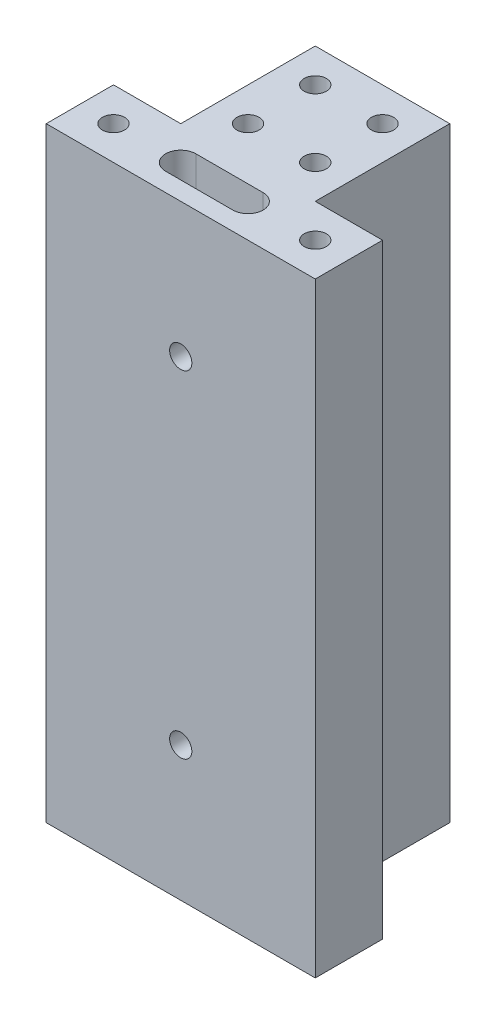
ISO-10303-21;
HEADER;
FILE_DESCRIPTION(('STEP AP214'),'2;1');
FILE_NAME('part.step','',(''),(''),'','','');
FILE_SCHEMA(('AUTOMOTIVE_DESIGN { 1 0 10303 214 1 1 1 1 }'));
ENDSEC;
DATA;
#1=APPLICATION_CONTEXT('core data for automotive mechanical design processes');
#2=APPLICATION_PROTOCOL_DEFINITION('international standard','automotive_design',2000,#1);
#3=PRODUCT_CONTEXT('',#1,'mechanical');
#4=PRODUCT('Part','Part','',(#3));
#5=PRODUCT_RELATED_PRODUCT_CATEGORY('part','',(#4));
#6=PRODUCT_DEFINITION_FORMATION('','',#4);
#7=PRODUCT_DEFINITION_CONTEXT('part definition',#1,'design');
#8=PRODUCT_DEFINITION('design','',#6,#7);
#9=PRODUCT_DEFINITION_SHAPE('','',#8);
#10=(LENGTH_UNIT() NAMED_UNIT(*) SI_UNIT(.MILLI.,.METRE.));
#11=(NAMED_UNIT(*) PLANE_ANGLE_UNIT() SI_UNIT($,.RADIAN.));
#12=(NAMED_UNIT(*) SI_UNIT($,.STERADIAN.) SOLID_ANGLE_UNIT());
#13=UNCERTAINTY_MEASURE_WITH_UNIT(LENGTH_MEASURE(1.E-05),#10,'distance_accuracy_value','');
#14=(GEOMETRIC_REPRESENTATION_CONTEXT(3) GLOBAL_UNCERTAINTY_ASSIGNED_CONTEXT((#13)) GLOBAL_UNIT_ASSIGNED_CONTEXT((#10,
#11,#12)) REPRESENTATION_CONTEXT('',''));
#15=CARTESIAN_POINT('',(0.,0.,0.));
#16=DIRECTION('',(0.,0.,1.));
#17=DIRECTION('',(1.,0.,0.));
#18=AXIS2_PLACEMENT_3D('',#15,#16,#17);
#19=CARTESIAN_POINT('',(0.,90.,0.));
#20=DIRECTION('',(0.,1.,0.));
#21=DIRECTION('',(0.,0.,1.));
#22=AXIS2_PLACEMENT_3D('',#19,#20,#21);
#23=PLANE('',#22);
#24=CARTESIAN_POINT('',(-15.,90.,0.));
#25=DIRECTION('',(0.,1.,0.));
#26=DIRECTION('',(0.,0.,1.));
#27=AXIS2_PLACEMENT_3D('',#24,#25,#26);
#28=CIRCLE('',#27,1.64999999999999);
#29=CARTESIAN_POINT('',(-15.,90.,1.64999999999999));
#30=VERTEX_POINT('',#29);
#31=EDGE_CURVE('E293',#30,#30,#28,.T.);
#32=ORIENTED_EDGE('',*,*,#31,.F.);
#33=EDGE_LOOP('',(#32));
#34=FACE_BOUND('',#33,.T.);
#35=CARTESIAN_POINT('',(15.,90.,0.));
#36=DIRECTION('',(0.,1.,0.));
#37=DIRECTION('',(0.,0.,1.));
#38=AXIS2_PLACEMENT_3D('',#35,#36,#37);
#39=CIRCLE('',#38,1.64999999999999);
#40=CARTESIAN_POINT('',(15.,90.,1.64999999999999));
#41=VERTEX_POINT('',#40);
#42=EDGE_CURVE('E285',#41,#41,#39,.T.);
#43=ORIENTED_EDGE('',*,*,#42,.F.);
#44=EDGE_LOOP('',(#43));
#45=FACE_BOUND('',#44,.T.);
#46=CARTESIAN_POINT('',(5.,90.,-20.));
#47=DIRECTION('',(0.,1.,0.));
#48=DIRECTION('',(0.,0.,1.));
#49=AXIS2_PLACEMENT_3D('',#46,#47,#48);
#50=CIRCLE('',#49,1.64999999999999);
#51=CARTESIAN_POINT('',(5.,90.,-18.35));
#52=VERTEX_POINT('',#51);
#53=EDGE_CURVE('E277',#52,#52,#50,.T.);
#54=ORIENTED_EDGE('',*,*,#53,.F.);
#55=EDGE_LOOP('',(#54));
#56=FACE_BOUND('',#55,.T.);
#57=CARTESIAN_POINT('',(-5.,90.,-10.));
#58=DIRECTION('',(0.,1.,0.));
#59=DIRECTION('',(0.,0.,1.));
#60=AXIS2_PLACEMENT_3D('',#57,#58,#59);
#61=CIRCLE('',#60,1.64999999999999);
#62=CARTESIAN_POINT('',(-5.,90.,-8.35000000000001));
#63=VERTEX_POINT('',#62);
#64=EDGE_CURVE('E269',#63,#63,#61,.T.);
#65=ORIENTED_EDGE('',*,*,#64,.F.);
#66=EDGE_LOOP('',(#65));
#67=FACE_BOUND('',#66,.T.);
#68=CARTESIAN_POINT('',(-5.,90.,-20.));
#69=DIRECTION('',(0.,1.,0.));
#70=DIRECTION('',(0.,0.,1.));
#71=AXIS2_PLACEMENT_3D('',#68,#69,#70);
#72=CIRCLE('',#71,1.64999999999999);
#73=CARTESIAN_POINT('',(-5.,90.,-18.35));
#74=VERTEX_POINT('',#73);
#75=EDGE_CURVE('E261',#74,#74,#72,.T.);
#76=ORIENTED_EDGE('',*,*,#75,.F.);
#77=EDGE_LOOP('',(#76));
#78=FACE_BOUND('',#77,.T.);
#79=CARTESIAN_POINT('',(5.,90.,-10.));
#80=DIRECTION('',(0.,1.,0.));
#81=DIRECTION('',(0.,0.,1.));
#82=AXIS2_PLACEMENT_3D('',#79,#80,#81);
#83=CIRCLE('',#82,1.64999999999999);
#84=CARTESIAN_POINT('',(5.,90.,-8.35000000000001));
#85=VERTEX_POINT('',#84);
#86=EDGE_CURVE('E253',#85,#85,#83,.T.);
#87=ORIENTED_EDGE('',*,*,#86,.F.);
#88=EDGE_LOOP('',(#87));
#89=FACE_BOUND('',#88,.T.);
#90=DIRECTION('',(0.,0.,-1.));
#91=VECTOR('',#90,1.);
#92=CARTESIAN_POINT('',(-10.,90.,0.));
#93=LINE('',#92,#91);
#94=CARTESIAN_POINT('',(-10.,90.,-5.));
#95=VERTEX_POINT('',#94);
#96=CARTESIAN_POINT('',(-10.,90.,-25.));
#97=VERTEX_POINT('',#96);
#98=EDGE_CURVE('E236',#95,#97,#93,.T.);
#99=ORIENTED_EDGE('',*,*,#98,.F.);
#100=DIRECTION('',(1.,0.,0.));
#101=VECTOR('',#100,1.);
#102=CARTESIAN_POINT('',(0.,90.,-5.));
#103=LINE('',#102,#101);
#104=CARTESIAN_POINT('',(-20.,90.,-5.));
#105=VERTEX_POINT('',#104);
#106=EDGE_CURVE('E227',#105,#95,#103,.T.);
#107=ORIENTED_EDGE('',*,*,#106,.F.);
#108=DIRECTION('',(0.,0.,-1.));
#109=VECTOR('',#108,1.);
#110=CARTESIAN_POINT('',(-20.,90.,0.));
#111=LINE('',#110,#109);
#112=CARTESIAN_POINT('',(-20.,90.,5.));
#113=VERTEX_POINT('',#112);
#114=EDGE_CURVE('E235',#113,#105,#111,.T.);
#115=ORIENTED_EDGE('',*,*,#114,.F.);
#116=DIRECTION('',(1.,0.,0.));
#117=VECTOR('',#116,1.);
#118=CARTESIAN_POINT('',(0.,90.,5.));
#119=LINE('',#118,#117);
#120=CARTESIAN_POINT('',(20.,90.,5.));
#121=VERTEX_POINT('',#120);
#122=EDGE_CURVE('E229',#113,#121,#119,.T.);
#123=ORIENTED_EDGE('',*,*,#122,.T.);
#124=DIRECTION('',(0.,0.,-1.));
#125=VECTOR('',#124,1.);
#126=CARTESIAN_POINT('',(20.,90.,0.));
#127=LINE('',#126,#125);
#128=CARTESIAN_POINT('',(20.,90.,-5.));
#129=VERTEX_POINT('',#128);
#130=EDGE_CURVE('E223',#121,#129,#127,.T.);
#131=ORIENTED_EDGE('',*,*,#130,.T.);
#132=CARTESIAN_POINT('',(10.,90.,-5.));
#133=VERTEX_POINT('',#132);
#134=EDGE_CURVE('E203',#133,#129,#103,.T.);
#135=ORIENTED_EDGE('',*,*,#134,.F.);
#136=DIRECTION('',(0.,0.,-1.));
#137=VECTOR('',#136,1.);
#138=CARTESIAN_POINT('',(10.,90.,0.));
#139=LINE('',#138,#137);
#140=CARTESIAN_POINT('',(10.,90.,-25.));
#141=VERTEX_POINT('',#140);
#142=EDGE_CURVE('E214',#133,#141,#139,.T.);
#143=ORIENTED_EDGE('',*,*,#142,.T.);
#144=DIRECTION('',(1.,0.,0.));
#145=VECTOR('',#144,1.);
#146=CARTESIAN_POINT('',(0.,90.,-25.));
#147=LINE('',#146,#145);
#148=EDGE_CURVE('E219',#97,#141,#147,.T.);
#149=ORIENTED_EDGE('',*,*,#148,.F.);
#150=EDGE_LOOP('',(#99,#107,#115,#123,#131,#135,#143,#149));
#151=FACE_BOUND('',#150,.T.);
#152=CARTESIAN_POINT('',(-5.,90.,0.));
#153=DIRECTION('',(0.,1.,0.));
#154=DIRECTION('',(0.,0.,1.));
#155=AXIS2_PLACEMENT_3D('',#152,#153,#154);
#156=CIRCLE('',#155,2.25);
#157=CARTESIAN_POINT('',(-5.,90.,-2.25));
#158=VERTEX_POINT('',#157);
#159=CARTESIAN_POINT('',(-5.,90.,2.25));
#160=VERTEX_POINT('',#159);
#161=EDGE_CURVE('E137',#158,#160,#156,.T.);
#162=ORIENTED_EDGE('',*,*,#161,.F.);
#163=DIRECTION('',(1.,0.,0.));
#164=VECTOR('',#163,1.);
#165=CARTESIAN_POINT('',(-5.,90.,-2.25));
#166=LINE('',#165,#164);
#167=CARTESIAN_POINT('',(5.,90.,-2.25));
#168=VERTEX_POINT('',#167);
#169=EDGE_CURVE('E342',#158,#168,#166,.T.);
#170=ORIENTED_EDGE('',*,*,#169,.T.);
#171=CARTESIAN_POINT('',(5.,90.,0.));
#172=DIRECTION('',(0.,1.,0.));
#173=DIRECTION('',(0.,0.,1.));
#174=AXIS2_PLACEMENT_3D('',#171,#172,#173);
#175=CIRCLE('',#174,2.25);
#176=CARTESIAN_POINT('',(5.,90.,2.25000000000003));
#177=VERTEX_POINT('',#176);
#178=EDGE_CURVE('E309',#177,#168,#175,.T.);
#179=ORIENTED_EDGE('',*,*,#178,.F.);
#180=DIRECTION('',(1.,0.,0.));
#181=VECTOR('',#180,1.);
#182=CARTESIAN_POINT('',(-5.,90.,2.25000000000003));
#183=LINE('',#182,#181);
#184=EDGE_CURVE('E358',#160,#177,#183,.T.);
#185=ORIENTED_EDGE('',*,*,#184,.F.);
#186=EDGE_LOOP('',(#162,#170,#179,#185));
#187=FACE_BOUND('',#186,.T.);
#188=ADVANCED_FACE('F121',(#34,#45,#56,#67,#78,#89,#151,#187),#23,.T.);
#189=CARTESIAN_POINT('',(-10.,90.,0.));
#190=DIRECTION('',(-1.,0.,0.));
#191=DIRECTION('',(0.,0.,1.));
#192=AXIS2_PLACEMENT_3D('',#189,#190,#191);
#193=PLANE('',#192);
#194=DIRECTION('',(0.,0.,-1.));
#195=VECTOR('',#194,1.);
#196=CARTESIAN_POINT('',(-10.,0.,0.));
#197=LINE('',#196,#195);
#198=CARTESIAN_POINT('',(-10.,0.,-5.));
#199=VERTEX_POINT('',#198);
#200=CARTESIAN_POINT('',(-10.,0.,-25.));
#201=VERTEX_POINT('',#200);
#202=EDGE_CURVE('E252',#199,#201,#197,.T.);
#203=ORIENTED_EDGE('',*,*,#202,.F.);
#204=DIRECTION('',(0.,-1.,0.));
#205=VECTOR('',#204,1.);
#206=CARTESIAN_POINT('',(-10.,90.,-5.));
#207=LINE('',#206,#205);
#208=EDGE_CURVE('E13',#95,#199,#207,.T.);
#209=ORIENTED_EDGE('',*,*,#208,.F.);
#210=ORIENTED_EDGE('',*,*,#98,.T.);
#211=DIRECTION('',(0.,-1.,0.));
#212=VECTOR('',#211,1.);
#213=CARTESIAN_POINT('',(-10.,90.,-25.));
#214=LINE('',#213,#212);
#215=EDGE_CURVE('E146',#97,#201,#214,.T.);
#216=ORIENTED_EDGE('',*,*,#215,.T.);
#217=EDGE_LOOP('',(#203,#209,#210,#216));
#218=FACE_BOUND('',#217,.T.);
#219=ADVANCED_FACE('F123',(#218),#193,.T.);
#220=CARTESIAN_POINT('',(0.,90.,-5.));
#221=DIRECTION('',(0.,0.,-1.));
#222=DIRECTION('',(-1.,0.,0.));
#223=AXIS2_PLACEMENT_3D('',#220,#221,#222);
#224=PLANE('',#223);
#225=DIRECTION('',(1.,0.,0.));
#226=VECTOR('',#225,1.);
#227=CARTESIAN_POINT('',(0.,0.,-5.));
#228=LINE('',#227,#226);
#229=CARTESIAN_POINT('',(-20.,0.,-5.));
#230=VERTEX_POINT('',#229);
#231=EDGE_CURVE('E445',#230,#199,#228,.T.);
#232=ORIENTED_EDGE('',*,*,#231,.F.);
#233=DIRECTION('',(0.,-1.,0.));
#234=VECTOR('',#233,1.);
#235=CARTESIAN_POINT('',(-20.,90.,-5.));
#236=LINE('',#235,#234);
#237=EDGE_CURVE('E130',#105,#230,#236,.T.);
#238=ORIENTED_EDGE('',*,*,#237,.F.);
#239=ORIENTED_EDGE('',*,*,#106,.T.);
#240=ORIENTED_EDGE('',*,*,#208,.T.);
#241=EDGE_LOOP('',(#232,#238,#239,#240));
#242=FACE_BOUND('',#241,.T.);
#243=ADVANCED_FACE('F462',(#242),#224,.T.);
#244=CARTESIAN_POINT('',(-20.,90.,0.));
#245=DIRECTION('',(-1.,0.,0.));
#246=DIRECTION('',(0.,0.,1.));
#247=AXIS2_PLACEMENT_3D('',#244,#245,#246);
#248=PLANE('',#247);
#249=DIRECTION('',(0.,0.,-1.));
#250=VECTOR('',#249,1.);
#251=CARTESIAN_POINT('',(-20.,0.,0.));
#252=LINE('',#251,#250);
#253=CARTESIAN_POINT('',(-20.,0.,5.));
#254=VERTEX_POINT('',#253);
#255=EDGE_CURVE('E434',#254,#230,#252,.T.);
#256=ORIENTED_EDGE('',*,*,#255,.F.);
#257=DIRECTION('',(0.,-1.,0.));
#258=VECTOR('',#257,1.);
#259=CARTESIAN_POINT('',(-20.,90.,5.));
#260=LINE('',#259,#258);
#261=EDGE_CURVE('E427',#113,#254,#260,.T.);
#262=ORIENTED_EDGE('',*,*,#261,.F.);
#263=ORIENTED_EDGE('',*,*,#114,.T.);
#264=ORIENTED_EDGE('',*,*,#237,.T.);
#265=EDGE_LOOP('',(#256,#262,#263,#264));
#266=FACE_BOUND('',#265,.T.);
#267=ADVANCED_FACE('F417',(#266),#248,.T.);
#268=CARTESIAN_POINT('',(0.,90.,5.));
#269=DIRECTION('',(0.,0.,-1.));
#270=DIRECTION('',(-1.,0.,0.));
#271=AXIS2_PLACEMENT_3D('',#268,#269,#270);
#272=PLANE('',#271);
#273=CARTESIAN_POINT('',(0.,70.,5.));
#274=DIRECTION('',(0.,0.,1.));
#275=DIRECTION('',(1.,0.,0.));
#276=AXIS2_PLACEMENT_3D('',#273,#274,#275);
#277=CIRCLE('',#276,1.64999999999999);
#278=CARTESIAN_POINT('',(1.64999999999999,70.,5.));
#279=VERTEX_POINT('',#278);
#280=EDGE_CURVE('E406',#279,#279,#277,.T.);
#281=ORIENTED_EDGE('',*,*,#280,.F.);
#282=EDGE_LOOP('',(#281));
#283=FACE_BOUND('',#282,.T.);
#284=CARTESIAN_POINT('',(0.,20.,5.));
#285=DIRECTION('',(0.,0.,1.));
#286=DIRECTION('',(1.,0.,0.));
#287=AXIS2_PLACEMENT_3D('',#284,#285,#286);
#288=CIRCLE('',#287,1.64999999999999);
#289=CARTESIAN_POINT('',(1.64999999999999,20.,5.));
#290=VERTEX_POINT('',#289);
#291=EDGE_CURVE('E398',#290,#290,#288,.T.);
#292=ORIENTED_EDGE('',*,*,#291,.F.);
#293=EDGE_LOOP('',(#292));
#294=FACE_BOUND('',#293,.T.);
#295=DIRECTION('',(1.,0.,0.));
#296=VECTOR('',#295,1.);
#297=CARTESIAN_POINT('',(0.,0.,5.));
#298=LINE('',#297,#296);
#299=CARTESIAN_POINT('',(20.,0.,5.));
#300=VERTEX_POINT('',#299);
#301=EDGE_CURVE('E423',#254,#300,#298,.T.);
#302=ORIENTED_EDGE('',*,*,#301,.T.);
#303=DIRECTION('',(0.,-1.,0.));
#304=VECTOR('',#303,1.);
#305=CARTESIAN_POINT('',(20.,90.,5.));
#306=LINE('',#305,#304);
#307=EDGE_CURVE('E426',#121,#300,#306,.T.);
#308=ORIENTED_EDGE('',*,*,#307,.F.);
#309=ORIENTED_EDGE('',*,*,#122,.F.);
#310=ORIENTED_EDGE('',*,*,#261,.T.);
#311=EDGE_LOOP('',(#302,#308,#309,#310));
#312=FACE_BOUND('',#311,.T.);
#313=ADVANCED_FACE('F413',(#283,#294,#312),#272,.F.);
#314=CARTESIAN_POINT('',(20.,90.,0.));
#315=DIRECTION('',(-1.,0.,0.));
#316=DIRECTION('',(0.,0.,1.));
#317=AXIS2_PLACEMENT_3D('',#314,#315,#316);
#318=PLANE('',#317);
#319=DIRECTION('',(0.,0.,-1.));
#320=VECTOR('',#319,1.);
#321=CARTESIAN_POINT('',(20.,0.,0.));
#322=LINE('',#321,#320);
#323=CARTESIAN_POINT('',(20.,0.,-5.));
#324=VERTEX_POINT('',#323);
#325=EDGE_CURVE('E433',#300,#324,#322,.T.);
#326=ORIENTED_EDGE('',*,*,#325,.T.);
#327=DIRECTION('',(0.,-1.,0.));
#328=VECTOR('',#327,1.);
#329=CARTESIAN_POINT('',(20.,90.,-5.));
#330=LINE('',#329,#328);
#331=EDGE_CURVE('E210',#129,#324,#330,.T.);
#332=ORIENTED_EDGE('',*,*,#331,.F.);
#333=ORIENTED_EDGE('',*,*,#130,.F.);
#334=ORIENTED_EDGE('',*,*,#307,.T.);
#335=EDGE_LOOP('',(#326,#332,#333,#334));
#336=FACE_BOUND('',#335,.T.);
#337=ADVANCED_FACE('F416',(#336),#318,.F.);
#338=CARTESIAN_POINT('',(10.,0.,-5.));
#339=VERTEX_POINT('',#338);
#340=EDGE_CURVE('E205',#339,#324,#228,.T.);
#341=ORIENTED_EDGE('',*,*,#340,.F.);
#342=DIRECTION('',(0.,-1.,0.));
#343=VECTOR('',#342,1.);
#344=CARTESIAN_POINT('',(10.,90.,-5.));
#345=LINE('',#344,#343);
#346=EDGE_CURVE('E199',#133,#339,#345,.T.);
#347=ORIENTED_EDGE('',*,*,#346,.F.);
#348=ORIENTED_EDGE('',*,*,#134,.T.);
#349=ORIENTED_EDGE('',*,*,#331,.T.);
#350=EDGE_LOOP('',(#341,#347,#348,#349));
#351=FACE_BOUND('',#350,.T.);
#352=ADVANCED_FACE('F201',(#351),#224,.T.);
#353=CARTESIAN_POINT('',(10.,90.,0.));
#354=DIRECTION('',(-1.,0.,0.));
#355=DIRECTION('',(0.,0.,1.));
#356=AXIS2_PLACEMENT_3D('',#353,#354,#355);
#357=PLANE('',#356);
#358=DIRECTION('',(0.,0.,-1.));
#359=VECTOR('',#358,1.);
#360=CARTESIAN_POINT('',(10.,0.,0.));
#361=LINE('',#360,#359);
#362=CARTESIAN_POINT('',(10.,0.,-25.));
#363=VERTEX_POINT('',#362);
#364=EDGE_CURVE('E245',#339,#363,#361,.T.);
#365=ORIENTED_EDGE('',*,*,#364,.T.);
#366=DIRECTION('',(0.,-1.,0.));
#367=VECTOR('',#366,1.);
#368=CARTESIAN_POINT('',(10.,90.,-25.));
#369=LINE('',#368,#367);
#370=EDGE_CURVE('E211',#141,#363,#369,.T.);
#371=ORIENTED_EDGE('',*,*,#370,.F.);
#372=ORIENTED_EDGE('',*,*,#142,.F.);
#373=ORIENTED_EDGE('',*,*,#346,.T.);
#374=EDGE_LOOP('',(#365,#371,#372,#373));
#375=FACE_BOUND('',#374,.T.);
#376=ADVANCED_FACE('F215',(#375),#357,.F.);
#377=CARTESIAN_POINT('',(0.,90.,-25.));
#378=DIRECTION('',(0.,0.,-1.));
#379=DIRECTION('',(-1.,0.,0.));
#380=AXIS2_PLACEMENT_3D('',#377,#378,#379);
#381=PLANE('',#380);
#382=DIRECTION('',(1.,0.,0.));
#383=VECTOR('',#382,1.);
#384=CARTESIAN_POINT('',(0.,0.,-25.));
#385=LINE('',#384,#383);
#386=EDGE_CURVE('E242',#201,#363,#385,.T.);
#387=ORIENTED_EDGE('',*,*,#386,.F.);
#388=ORIENTED_EDGE('',*,*,#215,.F.);
#389=ORIENTED_EDGE('',*,*,#148,.T.);
#390=ORIENTED_EDGE('',*,*,#370,.T.);
#391=EDGE_LOOP('',(#387,#388,#389,#390));
#392=FACE_BOUND('',#391,.T.);
#393=ADVANCED_FACE('F471',(#392),#381,.T.);
#394=CARTESIAN_POINT('',(0.,0.,0.));
#395=DIRECTION('',(0.,1.,0.));
#396=DIRECTION('',(0.,0.,1.));
#397=AXIS2_PLACEMENT_3D('',#394,#395,#396);
#398=PLANE('',#397);
#399=CARTESIAN_POINT('',(15.,0.,0.));
#400=DIRECTION('',(0.,-1.,0.));
#401=DIRECTION('',(0.,0.,-1.));
#402=AXIS2_PLACEMENT_3D('',#399,#400,#401);
#403=CIRCLE('',#402,1.65);
#404=CARTESIAN_POINT('',(15.,0.,-1.65));
#405=VERTEX_POINT('',#404);
#406=EDGE_CURVE('E390',#405,#405,#403,.T.);
#407=ORIENTED_EDGE('',*,*,#406,.F.);
#408=EDGE_LOOP('',(#407));
#409=FACE_BOUND('',#408,.T.);
#410=CARTESIAN_POINT('',(-15.,0.,0.));
#411=DIRECTION('',(0.,-1.,0.));
#412=DIRECTION('',(0.,0.,-1.));
#413=AXIS2_PLACEMENT_3D('',#410,#411,#412);
#414=CIRCLE('',#413,1.65);
#415=CARTESIAN_POINT('',(-15.,0.,-1.65));
#416=VERTEX_POINT('',#415);
#417=EDGE_CURVE('E382',#416,#416,#414,.T.);
#418=ORIENTED_EDGE('',*,*,#417,.F.);
#419=EDGE_LOOP('',(#418));
#420=FACE_BOUND('',#419,.T.);
#421=CARTESIAN_POINT('',(5.,0.,-20.));
#422=DIRECTION('',(0.,-1.,0.));
#423=DIRECTION('',(0.,0.,-1.));
#424=AXIS2_PLACEMENT_3D('',#421,#422,#423);
#425=CIRCLE('',#424,1.65);
#426=CARTESIAN_POINT('',(5.,0.,-21.65));
#427=VERTEX_POINT('',#426);
#428=EDGE_CURVE('E374',#427,#427,#425,.T.);
#429=ORIENTED_EDGE('',*,*,#428,.F.);
#430=EDGE_LOOP('',(#429));
#431=FACE_BOUND('',#430,.T.);
#432=CARTESIAN_POINT('',(-5.,0.,-20.));
#433=DIRECTION('',(0.,-1.,0.));
#434=DIRECTION('',(0.,0.,-1.));
#435=AXIS2_PLACEMENT_3D('',#432,#433,#434);
#436=CIRCLE('',#435,1.65);
#437=CARTESIAN_POINT('',(-5.,0.,-21.65));
#438=VERTEX_POINT('',#437);
#439=EDGE_CURVE('E366',#438,#438,#436,.T.);
#440=ORIENTED_EDGE('',*,*,#439,.F.);
#441=EDGE_LOOP('',(#440));
#442=FACE_BOUND('',#441,.T.);
#443=ORIENTED_EDGE('',*,*,#202,.T.);
#444=ORIENTED_EDGE('',*,*,#386,.T.);
#445=ORIENTED_EDGE('',*,*,#364,.F.);
#446=ORIENTED_EDGE('',*,*,#340,.T.);
#447=ORIENTED_EDGE('',*,*,#325,.F.);
#448=ORIENTED_EDGE('',*,*,#301,.F.);
#449=ORIENTED_EDGE('',*,*,#255,.T.);
#450=ORIENTED_EDGE('',*,*,#231,.T.);
#451=EDGE_LOOP('',(#443,#444,#445,#446,#447,#448,#449,#450));
#452=FACE_BOUND('',#451,.T.);
#453=ADVANCED_FACE('F440',(#409,#420,#431,#442,#452),#398,.F.);
#454=CARTESIAN_POINT('',(5.,75.,-10.));
#455=DIRECTION('',(0.,1.,0.));
#456=DIRECTION('',(0.,0.,1.));
#457=AXIS2_PLACEMENT_3D('',#454,#455,#456);
#458=CONICAL_SURFACE('',#457,1.65,1.02974425867665);
#459=CARTESIAN_POINT('',(5.,74.0085799786045,-10.));
#460=VERTEX_POINT('',#459);
#461=VERTEX_LOOP('',#460);
#462=FACE_BOUND('',#461,.T.);
#463=CARTESIAN_POINT('',(5.,75.,-10.));
#464=DIRECTION('',(0.,1.,0.));
#465=DIRECTION('',(0.,0.,1.));
#466=AXIS2_PLACEMENT_3D('',#463,#464,#465);
#467=CIRCLE('',#466,1.65);
#468=CARTESIAN_POINT('',(5.,75.,-8.35));
#469=VERTEX_POINT('',#468);
#470=EDGE_CURVE('E248',#469,#469,#467,.T.);
#471=ORIENTED_EDGE('',*,*,#470,.T.);
#472=EDGE_LOOP('',(#471));
#473=FACE_BOUND('',#472,.T.);
#474=ADVANCED_FACE('F486',(#462,#473),#458,.F.);
#475=CARTESIAN_POINT('',(5.,90.,-10.));
#476=DIRECTION('',(0.,1.,0.));
#477=DIRECTION('',(0.,0.,1.));
#478=AXIS2_PLACEMENT_3D('',#475,#476,#477);
#479=CYLINDRICAL_SURFACE('',#478,1.64999999999999);
#480=ORIENTED_EDGE('',*,*,#470,.F.);
#481=EDGE_LOOP('',(#480));
#482=FACE_BOUND('',#481,.T.);
#483=ORIENTED_EDGE('',*,*,#86,.T.);
#484=EDGE_LOOP('',(#483));
#485=FACE_BOUND('',#484,.T.);
#486=ADVANCED_FACE('F533',(#482,#485),#479,.F.);
#487=CARTESIAN_POINT('',(-5.,75.,-20.));
#488=DIRECTION('',(0.,1.,0.));
#489=DIRECTION('',(0.,0.,1.));
#490=AXIS2_PLACEMENT_3D('',#487,#488,#489);
#491=CONICAL_SURFACE('',#490,1.65,1.02974425867665);
#492=CARTESIAN_POINT('',(-5.,74.0085799786045,-20.));
#493=VERTEX_POINT('',#492);
#494=VERTEX_LOOP('',#493);
#495=FACE_BOUND('',#494,.T.);
#496=CARTESIAN_POINT('',(-5.,75.,-20.));
#497=DIRECTION('',(0.,1.,0.));
#498=DIRECTION('',(0.,0.,1.));
#499=AXIS2_PLACEMENT_3D('',#496,#497,#498);
#500=CIRCLE('',#499,1.65);
#501=CARTESIAN_POINT('',(-5.,75.,-18.35));
#502=VERTEX_POINT('',#501);
#503=EDGE_CURVE('E257',#502,#502,#500,.T.);
#504=ORIENTED_EDGE('',*,*,#503,.T.);
#505=EDGE_LOOP('',(#504));
#506=FACE_BOUND('',#505,.T.);
#507=ADVANCED_FACE('F541',(#495,#506),#491,.F.);
#508=CARTESIAN_POINT('',(-5.,90.,-20.));
#509=DIRECTION('',(0.,1.,0.));
#510=DIRECTION('',(0.,0.,1.));
#511=AXIS2_PLACEMENT_3D('',#508,#509,#510);
#512=CYLINDRICAL_SURFACE('',#511,1.64999999999999);
#513=ORIENTED_EDGE('',*,*,#503,.F.);
#514=EDGE_LOOP('',(#513));
#515=FACE_BOUND('',#514,.T.);
#516=ORIENTED_EDGE('',*,*,#75,.T.);
#517=EDGE_LOOP('',(#516));
#518=FACE_BOUND('',#517,.T.);
#519=ADVANCED_FACE('F550',(#515,#518),#512,.F.);
#520=CARTESIAN_POINT('',(-5.,75.,-10.));
#521=DIRECTION('',(0.,1.,0.));
#522=DIRECTION('',(0.,0.,1.));
#523=AXIS2_PLACEMENT_3D('',#520,#521,#522);
#524=CONICAL_SURFACE('',#523,1.65,1.02974425867665);
#525=CARTESIAN_POINT('',(-5.,74.0085799786045,-10.));
#526=VERTEX_POINT('',#525);
#527=VERTEX_LOOP('',#526);
#528=FACE_BOUND('',#527,.T.);
#529=CARTESIAN_POINT('',(-5.,75.,-10.));
#530=DIRECTION('',(0.,1.,0.));
#531=DIRECTION('',(0.,0.,1.));
#532=AXIS2_PLACEMENT_3D('',#529,#530,#531);
#533=CIRCLE('',#532,1.65);
#534=CARTESIAN_POINT('',(-5.,75.,-8.35));
#535=VERTEX_POINT('',#534);
#536=EDGE_CURVE('E265',#535,#535,#533,.T.);
#537=ORIENTED_EDGE('',*,*,#536,.T.);
#538=EDGE_LOOP('',(#537));
#539=FACE_BOUND('',#538,.T.);
#540=ADVANCED_FACE('F558',(#528,#539),#524,.F.);
#541=CARTESIAN_POINT('',(-5.,90.,-10.));
#542=DIRECTION('',(0.,1.,0.));
#543=DIRECTION('',(0.,0.,1.));
#544=AXIS2_PLACEMENT_3D('',#541,#542,#543);
#545=CYLINDRICAL_SURFACE('',#544,1.64999999999999);
#546=ORIENTED_EDGE('',*,*,#536,.F.);
#547=EDGE_LOOP('',(#546));
#548=FACE_BOUND('',#547,.T.);
#549=ORIENTED_EDGE('',*,*,#64,.T.);
#550=EDGE_LOOP('',(#549));
#551=FACE_BOUND('',#550,.T.);
#552=ADVANCED_FACE('F567',(#548,#551),#545,.F.);
#553=CARTESIAN_POINT('',(5.,75.,-20.));
#554=DIRECTION('',(0.,1.,0.));
#555=DIRECTION('',(0.,0.,1.));
#556=AXIS2_PLACEMENT_3D('',#553,#554,#555);
#557=CONICAL_SURFACE('',#556,1.65,1.02974425867665);
#558=CARTESIAN_POINT('',(5.,74.0085799786045,-20.));
#559=VERTEX_POINT('',#558);
#560=VERTEX_LOOP('',#559);
#561=FACE_BOUND('',#560,.T.);
#562=CARTESIAN_POINT('',(5.,75.,-20.));
#563=DIRECTION('',(0.,1.,0.));
#564=DIRECTION('',(0.,0.,1.));
#565=AXIS2_PLACEMENT_3D('',#562,#563,#564);
#566=CIRCLE('',#565,1.65);
#567=CARTESIAN_POINT('',(5.,75.,-18.35));
#568=VERTEX_POINT('',#567);
#569=EDGE_CURVE('E273',#568,#568,#566,.T.);
#570=ORIENTED_EDGE('',*,*,#569,.T.);
#571=EDGE_LOOP('',(#570));
#572=FACE_BOUND('',#571,.T.);
#573=ADVANCED_FACE('F575',(#561,#572),#557,.F.);
#574=CARTESIAN_POINT('',(5.,90.,-20.));
#575=DIRECTION('',(0.,1.,0.));
#576=DIRECTION('',(0.,0.,1.));
#577=AXIS2_PLACEMENT_3D('',#574,#575,#576);
#578=CYLINDRICAL_SURFACE('',#577,1.64999999999999);
#579=ORIENTED_EDGE('',*,*,#569,.F.);
#580=EDGE_LOOP('',(#579));
#581=FACE_BOUND('',#580,.T.);
#582=ORIENTED_EDGE('',*,*,#53,.T.);
#583=EDGE_LOOP('',(#582));
#584=FACE_BOUND('',#583,.T.);
#585=ADVANCED_FACE('F584',(#581,#584),#578,.F.);
#586=CARTESIAN_POINT('',(15.,75.,0.));
#587=DIRECTION('',(0.,1.,0.));
#588=DIRECTION('',(0.,0.,1.));
#589=AXIS2_PLACEMENT_3D('',#586,#587,#588);
#590=CONICAL_SURFACE('',#589,1.65,1.02974425867665);
#591=CARTESIAN_POINT('',(15.,74.0085799786045,0.));
#592=VERTEX_POINT('',#591);
#593=VERTEX_LOOP('',#592);
#594=FACE_BOUND('',#593,.T.);
#595=CARTESIAN_POINT('',(15.,75.,0.));
#596=DIRECTION('',(0.,1.,0.));
#597=DIRECTION('',(0.,0.,1.));
#598=AXIS2_PLACEMENT_3D('',#595,#596,#597);
#599=CIRCLE('',#598,1.65);
#600=CARTESIAN_POINT('',(15.,75.,1.64999999999999));
#601=VERTEX_POINT('',#600);
#602=EDGE_CURVE('E281',#601,#601,#599,.T.);
#603=ORIENTED_EDGE('',*,*,#602,.T.);
#604=EDGE_LOOP('',(#603));
#605=FACE_BOUND('',#604,.T.);
#606=ADVANCED_FACE('F592',(#594,#605),#590,.F.);
#607=CARTESIAN_POINT('',(15.,90.,0.));
#608=DIRECTION('',(0.,1.,0.));
#609=DIRECTION('',(0.,0.,1.));
#610=AXIS2_PLACEMENT_3D('',#607,#608,#609);
#611=CYLINDRICAL_SURFACE('',#610,1.64999999999999);
#612=ORIENTED_EDGE('',*,*,#602,.F.);
#613=EDGE_LOOP('',(#612));
#614=FACE_BOUND('',#613,.T.);
#615=ORIENTED_EDGE('',*,*,#42,.T.);
#616=EDGE_LOOP('',(#615));
#617=FACE_BOUND('',#616,.T.);
#618=ADVANCED_FACE('F601',(#614,#617),#611,.F.);
#619=CARTESIAN_POINT('',(-15.,75.,0.));
#620=DIRECTION('',(0.,1.,0.));
#621=DIRECTION('',(0.,0.,1.));
#622=AXIS2_PLACEMENT_3D('',#619,#620,#621);
#623=CONICAL_SURFACE('',#622,1.65,1.02974425867665);
#624=CARTESIAN_POINT('',(-15.,74.0085799786045,0.));
#625=VERTEX_POINT('',#624);
#626=VERTEX_LOOP('',#625);
#627=FACE_BOUND('',#626,.T.);
#628=CARTESIAN_POINT('',(-15.,75.,0.));
#629=DIRECTION('',(0.,1.,0.));
#630=DIRECTION('',(0.,0.,1.));
#631=AXIS2_PLACEMENT_3D('',#628,#629,#630);
#632=CIRCLE('',#631,1.65);
#633=CARTESIAN_POINT('',(-15.,75.,1.65));
#634=VERTEX_POINT('',#633);
#635=EDGE_CURVE('E289',#634,#634,#632,.T.);
#636=ORIENTED_EDGE('',*,*,#635,.T.);
#637=EDGE_LOOP('',(#636));
#638=FACE_BOUND('',#637,.T.);
#639=ADVANCED_FACE('F609',(#627,#638),#623,.F.);
#640=CARTESIAN_POINT('',(-15.,90.,0.));
#641=DIRECTION('',(0.,1.,0.));
#642=DIRECTION('',(0.,0.,1.));
#643=AXIS2_PLACEMENT_3D('',#640,#641,#642);
#644=CYLINDRICAL_SURFACE('',#643,1.64999999999999);
#645=ORIENTED_EDGE('',*,*,#635,.F.);
#646=EDGE_LOOP('',(#645));
#647=FACE_BOUND('',#646,.T.);
#648=ORIENTED_EDGE('',*,*,#31,.T.);
#649=EDGE_LOOP('',(#648));
#650=FACE_BOUND('',#649,.T.);
#651=ADVANCED_FACE('F617',(#647,#650),#644,.F.);
#652=CARTESIAN_POINT('',(5.,75.,0.));
#653=DIRECTION('',(0.,1.,0.));
#654=DIRECTION('',(0.,0.,1.));
#655=AXIS2_PLACEMENT_3D('',#652,#653,#654);
#656=CONICAL_SURFACE('',#655,2.25,1.02974425867665);
#657=CARTESIAN_POINT('',(5.,75.,0.));
#658=DIRECTION('',(0.,1.,0.));
#659=DIRECTION('',(0.,0.,1.));
#660=AXIS2_PLACEMENT_3D('',#657,#658,#659);
#661=CIRCLE('',#660,2.25);
#662=CARTESIAN_POINT('',(5.,75.,2.25));
#663=VERTEX_POINT('',#662);
#664=CARTESIAN_POINT('',(5.,75.,-2.25));
#665=VERTEX_POINT('',#664);
#666=EDGE_CURVE('E305',#663,#665,#661,.T.);
#667=ORIENTED_EDGE('',*,*,#666,.T.);
#668=DIRECTION('',(0.,-0.515038074910057,0.857167300702111));
#669=VECTOR('',#668,1.);
#670=CARTESIAN_POINT('',(5.,73.648063607188,0.));
#671=LINE('',#670,#669);
#672=CARTESIAN_POINT('',(5.,73.648063607188,0.));
#673=VERTEX_POINT('',#672);
#674=EDGE_CURVE('E317',#673,#665,#671,.F.);
#675=ORIENTED_EDGE('',*,*,#674,.F.);
#676=DIRECTION('',(0.,0.515038074910057,0.857167300702111));
#677=VECTOR('',#676,1.);
#678=CARTESIAN_POINT('',(5.,73.648063607188,0.));
#679=LINE('',#678,#677);
#680=EDGE_CURVE('E313',#663,#673,#679,.F.);
#681=ORIENTED_EDGE('',*,*,#680,.F.);
#682=EDGE_LOOP('',(#667,#675,#681));
#683=FACE_BOUND('',#682,.T.);
#684=ADVANCED_FACE('F625',(#683),#656,.F.);
#685=CARTESIAN_POINT('',(5.,90.,0.));
#686=DIRECTION('',(0.,1.,0.));
#687=DIRECTION('',(0.,0.,1.));
#688=AXIS2_PLACEMENT_3D('',#685,#686,#687);
#689=CYLINDRICAL_SURFACE('',#688,2.25);
#690=ORIENTED_EDGE('',*,*,#666,.F.);
#691=DIRECTION('',(0.,1.,0.));
#692=VECTOR('',#691,1.);
#693=CARTESIAN_POINT('',(5.,90.,2.25));
#694=LINE('',#693,#692);
#695=EDGE_CURVE('E297',#177,#663,#694,.F.);
#696=ORIENTED_EDGE('',*,*,#695,.F.);
#697=ORIENTED_EDGE('',*,*,#178,.T.);
#698=DIRECTION('',(0.,1.,0.));
#699=VECTOR('',#698,1.);
#700=CARTESIAN_POINT('',(5.,90.,-2.25));
#701=LINE('',#700,#699);
#702=EDGE_CURVE('E301',#665,#168,#701,.T.);
#703=ORIENTED_EDGE('',*,*,#702,.F.);
#704=EDGE_LOOP('',(#690,#696,#697,#703));
#705=FACE_BOUND('',#704,.T.);
#706=ADVANCED_FACE('F634',(#705),#689,.F.);
#707=CARTESIAN_POINT('',(-5.,75.,0.));
#708=DIRECTION('',(0.,1.,0.));
#709=DIRECTION('',(0.,0.,1.));
#710=AXIS2_PLACEMENT_3D('',#707,#708,#709);
#711=CONICAL_SURFACE('',#710,2.25,1.02974425867665);
#712=CARTESIAN_POINT('',(-5.,75.,0.));
#713=DIRECTION('',(0.,1.,0.));
#714=DIRECTION('',(0.,0.,1.));
#715=AXIS2_PLACEMENT_3D('',#712,#713,#714);
#716=CIRCLE('',#715,2.25);
#717=CARTESIAN_POINT('',(-5.,75.,-2.25));
#718=VERTEX_POINT('',#717);
#719=CARTESIAN_POINT('',(-5.,75.,2.25));
#720=VERTEX_POINT('',#719);
#721=EDGE_CURVE('E328',#718,#720,#716,.T.);
#722=ORIENTED_EDGE('',*,*,#721,.T.);
#723=DIRECTION('',(0.,-0.515038074910057,-0.857167300702111));
#724=VECTOR('',#723,1.);
#725=CARTESIAN_POINT('',(-5.,73.648063607188,0.));
#726=LINE('',#725,#724);
#727=CARTESIAN_POINT('',(-5.,73.648063607188,0.));
#728=VERTEX_POINT('',#727);
#729=EDGE_CURVE('E338',#728,#720,#726,.F.);
#730=ORIENTED_EDGE('',*,*,#729,.F.);
#731=DIRECTION('',(0.,0.515038074910057,-0.857167300702111));
#732=VECTOR('',#731,1.);
#733=CARTESIAN_POINT('',(-5.,73.648063607188,0.));
#734=LINE('',#733,#732);
#735=EDGE_CURVE('E334',#718,#728,#734,.F.);
#736=ORIENTED_EDGE('',*,*,#735,.F.);
#737=EDGE_LOOP('',(#722,#730,#736));
#738=FACE_BOUND('',#737,.T.);
#739=ADVANCED_FACE('F642',(#738),#711,.F.);
#740=CARTESIAN_POINT('',(-5.,90.,0.));
#741=DIRECTION('',(0.,1.,0.));
#742=DIRECTION('',(0.,0.,1.));
#743=AXIS2_PLACEMENT_3D('',#740,#741,#742);
#744=CYLINDRICAL_SURFACE('',#743,2.25);
#745=ORIENTED_EDGE('',*,*,#161,.T.);
#746=DIRECTION('',(0.,1.,0.));
#747=VECTOR('',#746,1.);
#748=CARTESIAN_POINT('',(-5.,90.,2.25));
#749=LINE('',#748,#747);
#750=EDGE_CURVE('E325',#720,#160,#749,.T.);
#751=ORIENTED_EDGE('',*,*,#750,.F.);
#752=ORIENTED_EDGE('',*,*,#721,.F.);
#753=DIRECTION('',(0.,1.,0.));
#754=VECTOR('',#753,1.);
#755=CARTESIAN_POINT('',(-5.,90.,-2.25));
#756=LINE('',#755,#754);
#757=EDGE_CURVE('E321',#158,#718,#756,.F.);
#758=ORIENTED_EDGE('',*,*,#757,.F.);
#759=EDGE_LOOP('',(#745,#751,#752,#758));
#760=FACE_BOUND('',#759,.T.);
#761=ADVANCED_FACE('F650',(#760),#744,.F.);
#762=CARTESIAN_POINT('',(-5.,90.,-2.25));
#763=DIRECTION('',(0.,0.,-1.));
#764=DIRECTION('',(-1.,0.,0.));
#765=AXIS2_PLACEMENT_3D('',#762,#763,#764);
#766=PLANE('',#765);
#767=ORIENTED_EDGE('',*,*,#702,.T.);
#768=ORIENTED_EDGE('',*,*,#169,.F.);
#769=ORIENTED_EDGE('',*,*,#757,.T.);
#770=DIRECTION('',(1.,0.,0.));
#771=VECTOR('',#770,1.);
#772=CARTESIAN_POINT('',(-5.,75.,-2.25));
#773=LINE('',#772,#771);
#774=EDGE_CURVE('E346',#718,#665,#773,.T.);
#775=ORIENTED_EDGE('',*,*,#774,.T.);
#776=EDGE_LOOP('',(#767,#768,#769,#775));
#777=FACE_BOUND('',#776,.T.);
#778=ADVANCED_FACE('F658',(#777),#766,.F.);
#779=CARTESIAN_POINT('',(-5.,73.648063607188,0.));
#780=DIRECTION('',(0.,-0.857167300702111,-0.515038074910057));
#781=DIRECTION('',(0.,0.515038074910057,-0.857167300702111));
#782=AXIS2_PLACEMENT_3D('',#779,#780,#781);
#783=PLANE('',#782);
#784=ORIENTED_EDGE('',*,*,#674,.T.);
#785=ORIENTED_EDGE('',*,*,#774,.F.);
#786=ORIENTED_EDGE('',*,*,#735,.T.);
#787=DIRECTION('',(1.,0.,0.));
#788=VECTOR('',#787,1.);
#789=CARTESIAN_POINT('',(-5.,73.648063607188,0.));
#790=LINE('',#789,#788);
#791=EDGE_CURVE('E350',#728,#673,#790,.T.);
#792=ORIENTED_EDGE('',*,*,#791,.T.);
#793=EDGE_LOOP('',(#784,#785,#786,#792));
#794=FACE_BOUND('',#793,.T.);
#795=ADVANCED_FACE('F665',(#794),#783,.F.);
#796=CARTESIAN_POINT('',(-5.,73.648063607188,0.));
#797=DIRECTION('',(0.,-0.857167300702111,0.515038074910057));
#798=DIRECTION('',(0.,-0.515038074910057,-0.857167300702111));
#799=AXIS2_PLACEMENT_3D('',#796,#797,#798);
#800=PLANE('',#799);
#801=ORIENTED_EDGE('',*,*,#680,.T.);
#802=ORIENTED_EDGE('',*,*,#791,.F.);
#803=ORIENTED_EDGE('',*,*,#729,.T.);
#804=DIRECTION('',(1.,0.,0.));
#805=VECTOR('',#804,1.);
#806=CARTESIAN_POINT('',(-5.,75.,2.25));
#807=LINE('',#806,#805);
#808=EDGE_CURVE('E354',#720,#663,#807,.T.);
#809=ORIENTED_EDGE('',*,*,#808,.T.);
#810=EDGE_LOOP('',(#801,#802,#803,#809));
#811=FACE_BOUND('',#810,.T.);
#812=ADVANCED_FACE('F673',(#811),#800,.F.);
#813=CARTESIAN_POINT('',(-5.,90.,2.25));
#814=DIRECTION('',(0.,0.,1.));
#815=DIRECTION('',(1.,0.,0.));
#816=AXIS2_PLACEMENT_3D('',#813,#814,#815);
#817=PLANE('',#816);
#818=ORIENTED_EDGE('',*,*,#695,.T.);
#819=ORIENTED_EDGE('',*,*,#808,.F.);
#820=ORIENTED_EDGE('',*,*,#750,.T.);
#821=ORIENTED_EDGE('',*,*,#184,.T.);
#822=EDGE_LOOP('',(#818,#819,#820,#821));
#823=FACE_BOUND('',#822,.T.);
#824=ADVANCED_FACE('F681',(#823),#817,.F.);
#825=CARTESIAN_POINT('',(-5.,15.,-20.));
#826=DIRECTION('',(0.,-1.,0.));
#827=DIRECTION('',(0.,0.,-1.));
#828=AXIS2_PLACEMENT_3D('',#825,#826,#827);
#829=CONICAL_SURFACE('',#828,1.65,1.02974425867665);
#830=CARTESIAN_POINT('',(-5.,15.9914200213955,-20.));
#831=VERTEX_POINT('',#830);
#832=VERTEX_LOOP('',#831);
#833=FACE_BOUND('',#832,.T.);
#834=CARTESIAN_POINT('',(-5.,15.,-20.));
#835=DIRECTION('',(0.,-1.,0.));
#836=DIRECTION('',(0.,0.,-1.));
#837=AXIS2_PLACEMENT_3D('',#834,#835,#836);
#838=CIRCLE('',#837,1.65);
#839=CARTESIAN_POINT('',(-5.,15.,-21.65));
#840=VERTEX_POINT('',#839);
#841=EDGE_CURVE('E362',#840,#840,#838,.T.);
#842=ORIENTED_EDGE('',*,*,#841,.T.);
#843=EDGE_LOOP('',(#842));
#844=FACE_BOUND('',#843,.T.);
#845=ADVANCED_FACE('F689',(#833,#844),#829,.F.);
#846=CARTESIAN_POINT('',(-5.,0.,-20.));
#847=DIRECTION('',(0.,-1.,0.));
#848=DIRECTION('',(0.,0.,-1.));
#849=AXIS2_PLACEMENT_3D('',#846,#847,#848);
#850=CYLINDRICAL_SURFACE('',#849,1.65);
#851=ORIENTED_EDGE('',*,*,#841,.F.);
#852=EDGE_LOOP('',(#851));
#853=FACE_BOUND('',#852,.T.);
#854=ORIENTED_EDGE('',*,*,#439,.T.);
#855=EDGE_LOOP('',(#854));
#856=FACE_BOUND('',#855,.T.);
#857=ADVANCED_FACE('F698',(#853,#856),#850,.F.);
#858=CARTESIAN_POINT('',(5.,15.,-20.));
#859=DIRECTION('',(0.,-1.,0.));
#860=DIRECTION('',(0.,0.,-1.));
#861=AXIS2_PLACEMENT_3D('',#858,#859,#860);
#862=CONICAL_SURFACE('',#861,1.65,1.02974425867665);
#863=CARTESIAN_POINT('',(5.,15.9914200213955,-20.));
#864=VERTEX_POINT('',#863);
#865=VERTEX_LOOP('',#864);
#866=FACE_BOUND('',#865,.T.);
#867=CARTESIAN_POINT('',(5.,15.,-20.));
#868=DIRECTION('',(0.,-1.,0.));
#869=DIRECTION('',(0.,0.,-1.));
#870=AXIS2_PLACEMENT_3D('',#867,#868,#869);
#871=CIRCLE('',#870,1.65);
#872=CARTESIAN_POINT('',(5.,15.,-21.65));
#873=VERTEX_POINT('',#872);
#874=EDGE_CURVE('E370',#873,#873,#871,.T.);
#875=ORIENTED_EDGE('',*,*,#874,.T.);
#876=EDGE_LOOP('',(#875));
#877=FACE_BOUND('',#876,.T.);
#878=ADVANCED_FACE('F706',(#866,#877),#862,.F.);
#879=CARTESIAN_POINT('',(5.,0.,-20.));
#880=DIRECTION('',(0.,-1.,0.));
#881=DIRECTION('',(0.,0.,-1.));
#882=AXIS2_PLACEMENT_3D('',#879,#880,#881);
#883=CYLINDRICAL_SURFACE('',#882,1.65);
#884=ORIENTED_EDGE('',*,*,#874,.F.);
#885=EDGE_LOOP('',(#884));
#886=FACE_BOUND('',#885,.T.);
#887=ORIENTED_EDGE('',*,*,#428,.T.);
#888=EDGE_LOOP('',(#887));
#889=FACE_BOUND('',#888,.T.);
#890=ADVANCED_FACE('F714',(#886,#889),#883,.F.);
#891=CARTESIAN_POINT('',(-15.,15.,0.));
#892=DIRECTION('',(0.,-1.,0.));
#893=DIRECTION('',(0.,0.,-1.));
#894=AXIS2_PLACEMENT_3D('',#891,#892,#893);
#895=CONICAL_SURFACE('',#894,1.65,1.02974425867665);
#896=CARTESIAN_POINT('',(-15.,15.9914200213955,0.));
#897=VERTEX_POINT('',#896);
#898=VERTEX_LOOP('',#897);
#899=FACE_BOUND('',#898,.T.);
#900=CARTESIAN_POINT('',(-15.,15.,0.));
#901=DIRECTION('',(0.,-1.,0.));
#902=DIRECTION('',(0.,0.,-1.));
#903=AXIS2_PLACEMENT_3D('',#900,#901,#902);
#904=CIRCLE('',#903,1.65);
#905=CARTESIAN_POINT('',(-15.,15.,-1.65));
#906=VERTEX_POINT('',#905);
#907=EDGE_CURVE('E378',#906,#906,#904,.T.);
#908=ORIENTED_EDGE('',*,*,#907,.T.);
#909=EDGE_LOOP('',(#908));
#910=FACE_BOUND('',#909,.T.);
#911=ADVANCED_FACE('F722',(#899,#910),#895,.F.);
#912=CARTESIAN_POINT('',(-15.,0.,0.));
#913=DIRECTION('',(0.,-1.,0.));
#914=DIRECTION('',(0.,0.,-1.));
#915=AXIS2_PLACEMENT_3D('',#912,#913,#914);
#916=CYLINDRICAL_SURFACE('',#915,1.65);
#917=ORIENTED_EDGE('',*,*,#907,.F.);
#918=EDGE_LOOP('',(#917));
#919=FACE_BOUND('',#918,.T.);
#920=ORIENTED_EDGE('',*,*,#417,.T.);
#921=EDGE_LOOP('',(#920));
#922=FACE_BOUND('',#921,.T.);
#923=ADVANCED_FACE('F731',(#919,#922),#916,.F.);
#924=CARTESIAN_POINT('',(15.,15.,0.));
#925=DIRECTION('',(0.,-1.,0.));
#926=DIRECTION('',(0.,0.,-1.));
#927=AXIS2_PLACEMENT_3D('',#924,#925,#926);
#928=CONICAL_SURFACE('',#927,1.65,1.02974425867665);
#929=CARTESIAN_POINT('',(15.,15.9914200213955,0.));
#930=VERTEX_POINT('',#929);
#931=VERTEX_LOOP('',#930);
#932=FACE_BOUND('',#931,.T.);
#933=CARTESIAN_POINT('',(15.,15.,0.));
#934=DIRECTION('',(0.,-1.,0.));
#935=DIRECTION('',(0.,0.,-1.));
#936=AXIS2_PLACEMENT_3D('',#933,#934,#935);
#937=CIRCLE('',#936,1.65);
#938=CARTESIAN_POINT('',(15.,15.,-1.65));
#939=VERTEX_POINT('',#938);
#940=EDGE_CURVE('E386',#939,#939,#937,.T.);
#941=ORIENTED_EDGE('',*,*,#940,.T.);
#942=EDGE_LOOP('',(#941));
#943=FACE_BOUND('',#942,.T.);
#944=ADVANCED_FACE('F739',(#932,#943),#928,.F.);
#945=CARTESIAN_POINT('',(15.,0.,0.));
#946=DIRECTION('',(0.,-1.,0.));
#947=DIRECTION('',(0.,0.,-1.));
#948=AXIS2_PLACEMENT_3D('',#945,#946,#947);
#949=CYLINDRICAL_SURFACE('',#948,1.65);
#950=ORIENTED_EDGE('',*,*,#940,.F.);
#951=EDGE_LOOP('',(#950));
#952=FACE_BOUND('',#951,.T.);
#953=ORIENTED_EDGE('',*,*,#406,.T.);
#954=EDGE_LOOP('',(#953));
#955=FACE_BOUND('',#954,.T.);
#956=ADVANCED_FACE('F748',(#952,#955),#949,.F.);
#957=CARTESIAN_POINT('',(0.,20.,-10.));
#958=DIRECTION('',(0.,0.,1.));
#959=DIRECTION('',(1.,0.,0.));
#960=AXIS2_PLACEMENT_3D('',#957,#958,#959);
#961=CONICAL_SURFACE('',#960,1.64999999999999,1.02974425867665);
#962=CARTESIAN_POINT('',(0.,20.,-10.9914200213955));
#963=VERTEX_POINT('',#962);
#964=VERTEX_LOOP('',#963);
#965=FACE_BOUND('',#964,.T.);
#966=CARTESIAN_POINT('',(0.,20.,-10.));
#967=DIRECTION('',(0.,0.,1.));
#968=DIRECTION('',(1.,0.,0.));
#969=AXIS2_PLACEMENT_3D('',#966,#967,#968);
#970=CIRCLE('',#969,1.64999999999999);
#971=CARTESIAN_POINT('',(1.64999999999999,20.,-10.));
#972=VERTEX_POINT('',#971);
#973=EDGE_CURVE('E394',#972,#972,#970,.T.);
#974=ORIENTED_EDGE('',*,*,#973,.T.);
#975=EDGE_LOOP('',(#974));
#976=FACE_BOUND('',#975,.T.);
#977=ADVANCED_FACE('F756',(#965,#976),#961,.F.);
#978=CARTESIAN_POINT('',(0.,20.,5.));
#979=DIRECTION('',(0.,0.,1.));
#980=DIRECTION('',(1.,0.,0.));
#981=AXIS2_PLACEMENT_3D('',#978,#979,#980);
#982=CYLINDRICAL_SURFACE('',#981,1.64999999999999);
#983=ORIENTED_EDGE('',*,*,#973,.F.);
#984=EDGE_LOOP('',(#983));
#985=FACE_BOUND('',#984,.T.);
#986=ORIENTED_EDGE('',*,*,#291,.T.);
#987=EDGE_LOOP('',(#986));
#988=FACE_BOUND('',#987,.T.);
#989=ADVANCED_FACE('F765',(#985,#988),#982,.F.);
#990=CARTESIAN_POINT('',(0.,70.,-10.));
#991=DIRECTION('',(0.,0.,1.));
#992=DIRECTION('',(1.,0.,0.));
#993=AXIS2_PLACEMENT_3D('',#990,#991,#992);
#994=CONICAL_SURFACE('',#993,1.64999999999999,1.02974425867665);
#995=CARTESIAN_POINT('',(0.,70.,-10.9914200213955));
#996=VERTEX_POINT('',#995);
#997=VERTEX_LOOP('',#996);
#998=FACE_BOUND('',#997,.T.);
#999=CARTESIAN_POINT('',(0.,70.,-10.));
#1000=DIRECTION('',(0.,0.,1.));
#1001=DIRECTION('',(1.,0.,0.));
#1002=AXIS2_PLACEMENT_3D('',#999,#1000,#1001);
#1003=CIRCLE('',#1002,1.64999999999999);
#1004=CARTESIAN_POINT('',(1.64999999999999,70.,-10.));
#1005=VERTEX_POINT('',#1004);
#1006=EDGE_CURVE('E402',#1005,#1005,#1003,.T.);
#1007=ORIENTED_EDGE('',*,*,#1006,.T.);
#1008=EDGE_LOOP('',(#1007));
#1009=FACE_BOUND('',#1008,.T.);
#1010=ADVANCED_FACE('F774',(#998,#1009),#994,.F.);
#1011=CARTESIAN_POINT('',(0.,70.,5.));
#1012=DIRECTION('',(0.,0.,1.));
#1013=DIRECTION('',(1.,0.,0.));
#1014=AXIS2_PLACEMENT_3D('',#1011,#1012,#1013);
#1015=CYLINDRICAL_SURFACE('',#1014,1.64999999999999);
#1016=ORIENTED_EDGE('',*,*,#1006,.F.);
#1017=EDGE_LOOP('',(#1016));
#1018=FACE_BOUND('',#1017,.T.);
#1019=ORIENTED_EDGE('',*,*,#280,.T.);
#1020=EDGE_LOOP('',(#1019));
#1021=FACE_BOUND('',#1020,.T.);
#1022=ADVANCED_FACE('F411',(#1018,#1021),#1015,.F.);
#1023=CLOSED_SHELL('',(#188,#219,#243,#267,#313,#337,#352,#376,#393,#453,#474,#486,#507,#519,
#540,#552,#573,#585,#606,#618,#639,#651,#684,#706,#739,#761,#778,#795,#812,#824,#845,#857,#878,
#890,#911,#923,#944,#956,#977,#989,#1010,#1022));
#1024=MANIFOLD_SOLID_BREP('B2',#1023);
#1025=ADVANCED_BREP_SHAPE_REPRESENTATION('',(#18,#1024),#14);
#1026=SHAPE_DEFINITION_REPRESENTATION(#9,#1025);
ENDSEC;
END-ISO-10303-21;
